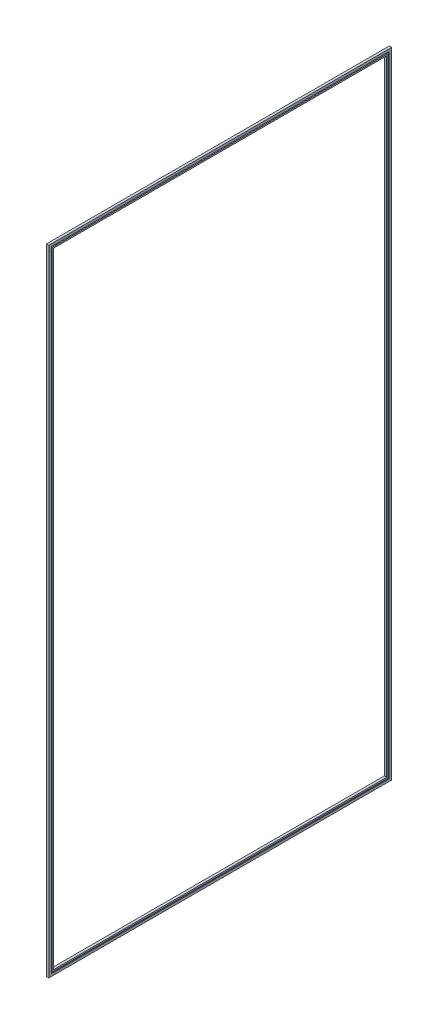
ISO-10303-21;
HEADER;
FILE_DESCRIPTION(('STEP AP214'),'2;1');
FILE_NAME('part.step','',(''),(''),'','','');
FILE_SCHEMA(('AUTOMOTIVE_DESIGN { 1 0 10303 214 1 1 1 1 }'));
ENDSEC;
DATA;
#1=APPLICATION_CONTEXT('core data for automotive mechanical design processes');
#2=APPLICATION_PROTOCOL_DEFINITION('international standard','automotive_design',2000,#1);
#3=PRODUCT_CONTEXT('',#1,'mechanical');
#4=PRODUCT('Part','Part','',(#3));
#5=PRODUCT_RELATED_PRODUCT_CATEGORY('part','',(#4));
#6=PRODUCT_DEFINITION_FORMATION('','',#4);
#7=PRODUCT_DEFINITION_CONTEXT('part definition',#1,'design');
#8=PRODUCT_DEFINITION('design','',#6,#7);
#9=PRODUCT_DEFINITION_SHAPE('','',#8);
#10=(LENGTH_UNIT() NAMED_UNIT(*) SI_UNIT(.MILLI.,.METRE.));
#11=(NAMED_UNIT(*) PLANE_ANGLE_UNIT() SI_UNIT($,.RADIAN.));
#12=(NAMED_UNIT(*) SI_UNIT($,.STERADIAN.) SOLID_ANGLE_UNIT());
#13=UNCERTAINTY_MEASURE_WITH_UNIT(LENGTH_MEASURE(1.E-05),#10,'distance_accuracy_value','');
#14=(GEOMETRIC_REPRESENTATION_CONTEXT(3) GLOBAL_UNCERTAINTY_ASSIGNED_CONTEXT((#13)) GLOBAL_UNIT_ASSIGNED_CONTEXT((#10,
#11,#12)) REPRESENTATION_CONTEXT('',''));
#15=CARTESIAN_POINT('',(0.,0.,0.));
#16=DIRECTION('',(0.,0.,1.));
#17=DIRECTION('',(1.,0.,0.));
#18=AXIS2_PLACEMENT_3D('',#15,#16,#17);
#19=CARTESIAN_POINT('',(1.,0.,0.));
#20=DIRECTION('',(-1.,0.,0.));
#21=DIRECTION('',(0.,0.,1.));
#22=AXIS2_PLACEMENT_3D('',#19,#20,#21);
#23=PLANE('',#22);
#24=DIRECTION('',(0.,1.,0.));
#25=VECTOR('',#24,1.);
#26=CARTESIAN_POINT('',(1.,-128.5,-68.5));
#27=LINE('',#26,#25);
#28=CARTESIAN_POINT('',(1.,-128.5,-68.5));
#29=VERTEX_POINT('',#28);
#30=CARTESIAN_POINT('',(1.,128.5,-68.5));
#31=VERTEX_POINT('',#30);
#32=EDGE_CURVE('E324',#29,#31,#27,.T.);
#33=ORIENTED_EDGE('',*,*,#32,.F.);
#34=DIRECTION('',(0.,0.,-1.));
#35=VECTOR('',#34,1.);
#36=CARTESIAN_POINT('',(1.,-128.5,-68.5));
#37=LINE('',#36,#35);
#38=CARTESIAN_POINT('',(1.,-128.5,68.5));
#39=VERTEX_POINT('',#38);
#40=EDGE_CURVE('E335',#39,#29,#37,.T.);
#41=ORIENTED_EDGE('',*,*,#40,.F.);
#42=DIRECTION('',(0.,-1.,0.));
#43=VECTOR('',#42,1.);
#44=CARTESIAN_POINT('',(1.,-128.5,68.5));
#45=LINE('',#44,#43);
#46=CARTESIAN_POINT('',(1.,128.5,68.5));
#47=VERTEX_POINT('',#46);
#48=EDGE_CURVE('E331',#47,#39,#45,.T.);
#49=ORIENTED_EDGE('',*,*,#48,.F.);
#50=DIRECTION('',(0.,0.,1.));
#51=VECTOR('',#50,1.);
#52=CARTESIAN_POINT('',(1.,128.5,-68.5));
#53=LINE('',#52,#51);
#54=EDGE_CURVE('E327',#31,#47,#53,.T.);
#55=ORIENTED_EDGE('',*,*,#54,.F.);
#56=EDGE_LOOP('',(#33,#41,#49,#55));
#57=FACE_BOUND('',#56,.T.);
#58=DIRECTION('',(0.,-1.,0.));
#59=VECTOR('',#58,1.);
#60=CARTESIAN_POINT('',(1.,129.1,69.1));
#61=LINE('',#60,#59);
#62=CARTESIAN_POINT('',(1.,129.1,69.1));
#63=VERTEX_POINT('',#62);
#64=CARTESIAN_POINT('',(1.,-129.1,69.1));
#65=VERTEX_POINT('',#64);
#66=EDGE_CURVE('E236',#63,#65,#61,.T.);
#67=ORIENTED_EDGE('',*,*,#66,.T.);
#68=DIRECTION('',(0.,0.,-1.));
#69=VECTOR('',#68,1.);
#70=CARTESIAN_POINT('',(1.,-129.1,69.1));
#71=LINE('',#70,#69);
#72=CARTESIAN_POINT('',(1.,-129.1,-69.1));
#73=VERTEX_POINT('',#72);
#74=EDGE_CURVE('E240',#65,#73,#71,.T.);
#75=ORIENTED_EDGE('',*,*,#74,.T.);
#76=DIRECTION('',(0.,-1.,0.));
#77=VECTOR('',#76,1.);
#78=CARTESIAN_POINT('',(1.,129.1,-69.1));
#79=LINE('',#78,#77);
#80=CARTESIAN_POINT('',(1.,129.1,-69.1));
#81=VERTEX_POINT('',#80);
#82=EDGE_CURVE('E244',#81,#73,#79,.T.);
#83=ORIENTED_EDGE('',*,*,#82,.F.);
#84=DIRECTION('',(0.,0.,-1.));
#85=VECTOR('',#84,1.);
#86=CARTESIAN_POINT('',(1.,129.1,69.1));
#87=LINE('',#86,#85);
#88=EDGE_CURVE('E193',#63,#81,#87,.T.);
#89=ORIENTED_EDGE('',*,*,#88,.F.);
#90=EDGE_LOOP('',(#67,#75,#83,#89));
#91=FACE_BOUND('',#90,.T.);
#92=ADVANCED_FACE('F48',(#57,#91),#23,.F.);
#93=DIRECTION('',(0.,0.,-1.));
#94=VECTOR('',#93,1.);
#95=CARTESIAN_POINT('',(1.,-129.5,69.5));
#96=LINE('',#95,#94);
#97=CARTESIAN_POINT('',(1.,-129.5,69.5));
#98=VERTEX_POINT('',#97);
#99=CARTESIAN_POINT('',(1.,-129.5,-69.5));
#100=VERTEX_POINT('',#99);
#101=EDGE_CURVE('E275',#98,#100,#96,.T.);
#102=ORIENTED_EDGE('',*,*,#101,.F.);
#103=DIRECTION('',(0.,-1.,0.));
#104=VECTOR('',#103,1.);
#105=CARTESIAN_POINT('',(1.,129.5,69.5));
#106=LINE('',#105,#104);
#107=CARTESIAN_POINT('',(1.,129.5,69.5));
#108=VERTEX_POINT('',#107);
#109=EDGE_CURVE('E64',#108,#98,#106,.T.);
#110=ORIENTED_EDGE('',*,*,#109,.F.);
#111=DIRECTION('',(0.,0.,-1.));
#112=VECTOR('',#111,1.);
#113=CARTESIAN_POINT('',(1.,129.5,69.5));
#114=LINE('',#113,#112);
#115=CARTESIAN_POINT('',(1.,129.5,-69.5));
#116=VERTEX_POINT('',#115);
#117=EDGE_CURVE('E262',#108,#116,#114,.T.);
#118=ORIENTED_EDGE('',*,*,#117,.T.);
#119=DIRECTION('',(0.,-1.,0.));
#120=VECTOR('',#119,1.);
#121=CARTESIAN_POINT('',(1.,129.5,-69.5));
#122=LINE('',#121,#120);
#123=EDGE_CURVE('E279',#116,#100,#122,.T.);
#124=ORIENTED_EDGE('',*,*,#123,.T.);
#125=EDGE_LOOP('',(#102,#110,#118,#124));
#126=FACE_BOUND('',#125,.T.);
#127=DIRECTION('',(0.,0.,1.));
#128=VECTOR('',#127,1.);
#129=CARTESIAN_POINT('',(1.,130.5,-70.5));
#130=LINE('',#129,#128);
#131=CARTESIAN_POINT('',(1.,130.5,-70.5));
#132=VERTEX_POINT('',#131);
#133=CARTESIAN_POINT('',(1.,130.5,70.5));
#134=VERTEX_POINT('',#133);
#135=EDGE_CURVE('E367',#132,#134,#130,.T.);
#136=ORIENTED_EDGE('',*,*,#135,.T.);
#137=DIRECTION('',(0.,-1.,0.));
#138=VECTOR('',#137,1.);
#139=CARTESIAN_POINT('',(1.,-130.5,70.5));
#140=LINE('',#139,#138);
#141=CARTESIAN_POINT('',(1.,-130.5,70.5));
#142=VERTEX_POINT('',#141);
#143=EDGE_CURVE('E371',#134,#142,#140,.T.);
#144=ORIENTED_EDGE('',*,*,#143,.T.);
#145=DIRECTION('',(0.,0.,-1.));
#146=VECTOR('',#145,1.);
#147=CARTESIAN_POINT('',(1.,-130.5,-70.5));
#148=LINE('',#147,#146);
#149=CARTESIAN_POINT('',(1.,-130.5,-70.5));
#150=VERTEX_POINT('',#149);
#151=EDGE_CURVE('E375',#142,#150,#148,.T.);
#152=ORIENTED_EDGE('',*,*,#151,.T.);
#153=DIRECTION('',(0.,1.,0.));
#154=VECTOR('',#153,1.);
#155=CARTESIAN_POINT('',(1.,-130.5,-70.5));
#156=LINE('',#155,#154);
#157=EDGE_CURVE('E378',#150,#132,#156,.T.);
#158=ORIENTED_EDGE('',*,*,#157,.T.);
#159=EDGE_LOOP('',(#136,#144,#152,#158));
#160=FACE_BOUND('',#159,.T.);
#161=ADVANCED_FACE('F421',(#126,#160),#23,.F.);
#162=CARTESIAN_POINT('',(0.,0.,0.));
#163=DIRECTION('',(-1.,0.,0.));
#164=DIRECTION('',(0.,0.,1.));
#165=AXIS2_PLACEMENT_3D('',#162,#163,#164);
#166=PLANE('',#165);
#167=DIRECTION('',(0.,0.,1.));
#168=VECTOR('',#167,1.);
#169=CARTESIAN_POINT('',(0.,130.5,-70.5));
#170=LINE('',#169,#168);
#171=CARTESIAN_POINT('',(0.,130.5,-70.5));
#172=VERTEX_POINT('',#171);
#173=CARTESIAN_POINT('',(0.,130.5,70.5));
#174=VERTEX_POINT('',#173);
#175=EDGE_CURVE('E366',#172,#174,#170,.T.);
#176=ORIENTED_EDGE('',*,*,#175,.F.);
#177=DIRECTION('',(0.,1.,0.));
#178=VECTOR('',#177,1.);
#179=CARTESIAN_POINT('',(0.,-130.5,-70.5));
#180=LINE('',#179,#178);
#181=CARTESIAN_POINT('',(0.,-130.5,-70.5));
#182=VERTEX_POINT('',#181);
#183=EDGE_CURVE('E372',#182,#172,#180,.T.);
#184=ORIENTED_EDGE('',*,*,#183,.F.);
#185=DIRECTION('',(0.,0.,-1.));
#186=VECTOR('',#185,1.);
#187=CARTESIAN_POINT('',(0.,-130.5,-70.5));
#188=LINE('',#187,#186);
#189=CARTESIAN_POINT('',(0.,-130.5,70.5));
#190=VERTEX_POINT('',#189);
#191=EDGE_CURVE('E388',#190,#182,#188,.T.);
#192=ORIENTED_EDGE('',*,*,#191,.F.);
#193=DIRECTION('',(0.,-1.,0.));
#194=VECTOR('',#193,1.);
#195=CARTESIAN_POINT('',(0.,-130.5,70.5));
#196=LINE('',#195,#194);
#197=EDGE_CURVE('E385',#174,#190,#196,.T.);
#198=ORIENTED_EDGE('',*,*,#197,.F.);
#199=EDGE_LOOP('',(#176,#184,#192,#198));
#200=FACE_BOUND('',#199,.T.);
#201=DIRECTION('',(0.,0.,-1.));
#202=VECTOR('',#201,1.);
#203=CARTESIAN_POINT('',(0.,-128.5,-68.5));
#204=LINE('',#203,#202);
#205=CARTESIAN_POINT('',(0.,-128.5,68.5));
#206=VERTEX_POINT('',#205);
#207=CARTESIAN_POINT('',(0.,-128.5,-68.5));
#208=VERTEX_POINT('',#207);
#209=EDGE_CURVE('E328',#206,#208,#204,.T.);
#210=ORIENTED_EDGE('',*,*,#209,.T.);
#211=DIRECTION('',(0.,1.,0.));
#212=VECTOR('',#211,1.);
#213=CARTESIAN_POINT('',(0.,-128.5,-68.5));
#214=LINE('',#213,#212);
#215=CARTESIAN_POINT('',(0.,128.5,-68.5));
#216=VERTEX_POINT('',#215);
#217=EDGE_CURVE('E310',#208,#216,#214,.T.);
#218=ORIENTED_EDGE('',*,*,#217,.T.);
#219=DIRECTION('',(0.,0.,1.));
#220=VECTOR('',#219,1.);
#221=CARTESIAN_POINT('',(0.,128.5,-68.5));
#222=LINE('',#221,#220);
#223=CARTESIAN_POINT('',(0.,128.5,68.5));
#224=VERTEX_POINT('',#223);
#225=EDGE_CURVE('E342',#216,#224,#222,.T.);
#226=ORIENTED_EDGE('',*,*,#225,.T.);
#227=DIRECTION('',(0.,-1.,0.));
#228=VECTOR('',#227,1.);
#229=CARTESIAN_POINT('',(0.,-128.5,68.5));
#230=LINE('',#229,#228);
#231=EDGE_CURVE('E346',#224,#206,#230,.T.);
#232=ORIENTED_EDGE('',*,*,#231,.T.);
#233=EDGE_LOOP('',(#210,#218,#226,#232));
#234=FACE_BOUND('',#233,.T.);
#235=ADVANCED_FACE('F411',(#200,#234),#166,.T.);
#236=CARTESIAN_POINT('',(1.,130.5,-70.5));
#237=DIRECTION('',(0.,-1.,0.));
#238=DIRECTION('',(0.,0.,-1.));
#239=AXIS2_PLACEMENT_3D('',#236,#237,#238);
#240=PLANE('',#239);
#241=ORIENTED_EDGE('',*,*,#175,.T.);
#242=DIRECTION('',(-1.,0.,0.));
#243=VECTOR('',#242,1.);
#244=CARTESIAN_POINT('',(1.,130.5,70.5));
#245=LINE('',#244,#243);
#246=EDGE_CURVE('E12',#134,#174,#245,.T.);
#247=ORIENTED_EDGE('',*,*,#246,.F.);
#248=ORIENTED_EDGE('',*,*,#135,.F.);
#249=DIRECTION('',(-1.,0.,0.));
#250=VECTOR('',#249,1.);
#251=CARTESIAN_POINT('',(1.,130.5,-70.5));
#252=LINE('',#251,#250);
#253=EDGE_CURVE('E381',#132,#172,#252,.T.);
#254=ORIENTED_EDGE('',*,*,#253,.T.);
#255=EDGE_LOOP('',(#241,#247,#248,#254));
#256=FACE_BOUND('',#255,.T.);
#257=ADVANCED_FACE('F50',(#256),#240,.F.);
#258=CARTESIAN_POINT('',(1.,-130.5,70.5));
#259=DIRECTION('',(0.,0.,-1.));
#260=DIRECTION('',(-1.,0.,0.));
#261=AXIS2_PLACEMENT_3D('',#258,#259,#260);
#262=PLANE('',#261);
#263=ORIENTED_EDGE('',*,*,#197,.T.);
#264=DIRECTION('',(-1.,0.,0.));
#265=VECTOR('',#264,1.);
#266=CARTESIAN_POINT('',(1.,-130.5,70.5));
#267=LINE('',#266,#265);
#268=EDGE_CURVE('E57',#142,#190,#267,.T.);
#269=ORIENTED_EDGE('',*,*,#268,.F.);
#270=ORIENTED_EDGE('',*,*,#143,.F.);
#271=ORIENTED_EDGE('',*,*,#246,.T.);
#272=EDGE_LOOP('',(#263,#269,#270,#271));
#273=FACE_BOUND('',#272,.T.);
#274=ADVANCED_FACE('F422',(#273),#262,.F.);
#275=CARTESIAN_POINT('',(1.,-130.5,-70.5));
#276=DIRECTION('',(0.,1.,0.));
#277=DIRECTION('',(0.,0.,1.));
#278=AXIS2_PLACEMENT_3D('',#275,#276,#277);
#279=PLANE('',#278);
#280=ORIENTED_EDGE('',*,*,#191,.T.);
#281=DIRECTION('',(-1.,0.,0.));
#282=VECTOR('',#281,1.);
#283=CARTESIAN_POINT('',(1.,-130.5,-70.5));
#284=LINE('',#283,#282);
#285=EDGE_CURVE('E396',#150,#182,#284,.T.);
#286=ORIENTED_EDGE('',*,*,#285,.F.);
#287=ORIENTED_EDGE('',*,*,#151,.F.);
#288=ORIENTED_EDGE('',*,*,#268,.T.);
#289=EDGE_LOOP('',(#280,#286,#287,#288));
#290=FACE_BOUND('',#289,.T.);
#291=ADVANCED_FACE('F405',(#290),#279,.F.);
#292=CARTESIAN_POINT('',(1.,-130.5,-70.5));
#293=DIRECTION('',(0.,0.,1.));
#294=DIRECTION('',(1.,0.,0.));
#295=AXIS2_PLACEMENT_3D('',#292,#293,#294);
#296=PLANE('',#295);
#297=ORIENTED_EDGE('',*,*,#183,.T.);
#298=ORIENTED_EDGE('',*,*,#253,.F.);
#299=ORIENTED_EDGE('',*,*,#157,.F.);
#300=ORIENTED_EDGE('',*,*,#285,.T.);
#301=EDGE_LOOP('',(#297,#298,#299,#300));
#302=FACE_BOUND('',#301,.T.);
#303=ADVANCED_FACE('F415',(#302),#296,.F.);
#304=CARTESIAN_POINT('',(1.,-128.5,-68.5));
#305=DIRECTION('',(0.,0.,1.));
#306=DIRECTION('',(1.,0.,0.));
#307=AXIS2_PLACEMENT_3D('',#304,#305,#306);
#308=PLANE('',#307);
#309=ORIENTED_EDGE('',*,*,#217,.F.);
#310=DIRECTION('',(-1.,0.,0.));
#311=VECTOR('',#310,1.);
#312=CARTESIAN_POINT('',(1.,-128.5,-68.5));
#313=LINE('',#312,#311);
#314=EDGE_CURVE('E338',#29,#208,#313,.T.);
#315=ORIENTED_EDGE('',*,*,#314,.F.);
#316=ORIENTED_EDGE('',*,*,#32,.T.);
#317=DIRECTION('',(-1.,0.,0.));
#318=VECTOR('',#317,1.);
#319=CARTESIAN_POINT('',(1.,128.5,-68.5));
#320=LINE('',#319,#318);
#321=EDGE_CURVE('E362',#31,#216,#320,.T.);
#322=ORIENTED_EDGE('',*,*,#321,.T.);
#323=EDGE_LOOP('',(#309,#315,#316,#322));
#324=FACE_BOUND('',#323,.T.);
#325=ADVANCED_FACE('F441',(#324),#308,.T.);
#326=CARTESIAN_POINT('',(1.,128.5,-68.5));
#327=DIRECTION('',(0.,-1.,0.));
#328=DIRECTION('',(0.,0.,-1.));
#329=AXIS2_PLACEMENT_3D('',#326,#327,#328);
#330=PLANE('',#329);
#331=ORIENTED_EDGE('',*,*,#225,.F.);
#332=ORIENTED_EDGE('',*,*,#321,.F.);
#333=ORIENTED_EDGE('',*,*,#54,.T.);
#334=DIRECTION('',(-1.,0.,0.));
#335=VECTOR('',#334,1.);
#336=CARTESIAN_POINT('',(1.,128.5,68.5));
#337=LINE('',#336,#335);
#338=EDGE_CURVE('E359',#47,#224,#337,.T.);
#339=ORIENTED_EDGE('',*,*,#338,.T.);
#340=EDGE_LOOP('',(#331,#332,#333,#339));
#341=FACE_BOUND('',#340,.T.);
#342=ADVANCED_FACE('F449',(#341),#330,.T.);
#343=CARTESIAN_POINT('',(1.,-128.5,68.5));
#344=DIRECTION('',(0.,0.,-1.));
#345=DIRECTION('',(-1.,0.,0.));
#346=AXIS2_PLACEMENT_3D('',#343,#344,#345);
#347=PLANE('',#346);
#348=ORIENTED_EDGE('',*,*,#231,.F.);
#349=ORIENTED_EDGE('',*,*,#338,.F.);
#350=ORIENTED_EDGE('',*,*,#48,.T.);
#351=DIRECTION('',(-1.,0.,0.));
#352=VECTOR('',#351,1.);
#353=CARTESIAN_POINT('',(1.,-128.5,68.5));
#354=LINE('',#353,#352);
#355=EDGE_CURVE('E356',#39,#206,#354,.T.);
#356=ORIENTED_EDGE('',*,*,#355,.T.);
#357=EDGE_LOOP('',(#348,#349,#350,#356));
#358=FACE_BOUND('',#357,.T.);
#359=ADVANCED_FACE('F454',(#358),#347,.T.);
#360=CARTESIAN_POINT('',(1.,-128.5,-68.5));
#361=DIRECTION('',(0.,1.,0.));
#362=DIRECTION('',(0.,0.,1.));
#363=AXIS2_PLACEMENT_3D('',#360,#361,#362);
#364=PLANE('',#363);
#365=ORIENTED_EDGE('',*,*,#209,.F.);
#366=ORIENTED_EDGE('',*,*,#355,.F.);
#367=ORIENTED_EDGE('',*,*,#40,.T.);
#368=ORIENTED_EDGE('',*,*,#314,.T.);
#369=EDGE_LOOP('',(#365,#366,#367,#368));
#370=FACE_BOUND('',#369,.T.);
#371=ADVANCED_FACE('F460',(#370),#364,.T.);
#372=CARTESIAN_POINT('',(0.800000000000002,129.5,69.5));
#373=DIRECTION('',(0.,0.,1.));
#374=DIRECTION('',(1.,0.,0.));
#375=AXIS2_PLACEMENT_3D('',#372,#373,#374);
#376=PLANE('',#375);
#377=ORIENTED_EDGE('',*,*,#109,.T.);
#378=DIRECTION('',(1.,0.,0.));
#379=VECTOR('',#378,1.);
#380=CARTESIAN_POINT('',(0.800000000000002,-129.5,69.5));
#381=LINE('',#380,#379);
#382=CARTESIAN_POINT('',(0.800000000000002,-129.5,69.5));
#383=VERTEX_POINT('',#382);
#384=EDGE_CURVE('E272',#383,#98,#381,.T.);
#385=ORIENTED_EDGE('',*,*,#384,.F.);
#386=DIRECTION('',(0.,-1.,0.));
#387=VECTOR('',#386,1.);
#388=CARTESIAN_POINT('',(0.800000000000002,129.5,69.5));
#389=LINE('',#388,#387);
#390=CARTESIAN_POINT('',(0.800000000000002,129.5,69.5));
#391=VERTEX_POINT('',#390);
#392=EDGE_CURVE('E257',#391,#383,#389,.T.);
#393=ORIENTED_EDGE('',*,*,#392,.F.);
#394=DIRECTION('',(1.,0.,0.));
#395=VECTOR('',#394,1.);
#396=CARTESIAN_POINT('',(0.800000000000002,129.5,69.5));
#397=LINE('',#396,#395);
#398=EDGE_CURVE('E286',#391,#108,#397,.T.);
#399=ORIENTED_EDGE('',*,*,#398,.T.);
#400=EDGE_LOOP('',(#377,#385,#393,#399));
#401=FACE_BOUND('',#400,.T.);
#402=ADVANCED_FACE('F471',(#401),#376,.F.);
#403=CARTESIAN_POINT('',(0.800000000000002,129.5,69.5));
#404=DIRECTION('',(0.,-1.,0.));
#405=DIRECTION('',(0.,0.,-1.));
#406=AXIS2_PLACEMENT_3D('',#403,#404,#405);
#407=PLANE('',#406);
#408=ORIENTED_EDGE('',*,*,#117,.F.);
#409=ORIENTED_EDGE('',*,*,#398,.F.);
#410=DIRECTION('',(0.,0.,-1.));
#411=VECTOR('',#410,1.);
#412=CARTESIAN_POINT('',(0.800000000000002,129.5,69.5));
#413=LINE('',#412,#411);
#414=CARTESIAN_POINT('',(0.800000000000002,129.5,-69.5));
#415=VERTEX_POINT('',#414);
#416=EDGE_CURVE('E269',#391,#415,#413,.T.);
#417=ORIENTED_EDGE('',*,*,#416,.T.);
#418=DIRECTION('',(1.,0.,0.));
#419=VECTOR('',#418,1.);
#420=CARTESIAN_POINT('',(0.800000000000002,129.5,-69.5));
#421=LINE('',#420,#419);
#422=EDGE_CURVE('E290',#415,#116,#421,.T.);
#423=ORIENTED_EDGE('',*,*,#422,.T.);
#424=EDGE_LOOP('',(#408,#409,#417,#423));
#425=FACE_BOUND('',#424,.T.);
#426=ADVANCED_FACE('F505',(#425),#407,.T.);
#427=CARTESIAN_POINT('',(0.800000000000002,129.5,-69.5));
#428=DIRECTION('',(0.,0.,1.));
#429=DIRECTION('',(0.,-1.,0.));
#430=AXIS2_PLACEMENT_3D('',#427,#428,#429);
#431=PLANE('',#430);
#432=ORIENTED_EDGE('',*,*,#123,.F.);
#433=ORIENTED_EDGE('',*,*,#422,.F.);
#434=DIRECTION('',(0.,-1.,0.));
#435=VECTOR('',#434,1.);
#436=CARTESIAN_POINT('',(0.800000000000002,129.5,-69.5));
#437=LINE('',#436,#435);
#438=CARTESIAN_POINT('',(0.800000000000002,-129.5,-69.5));
#439=VERTEX_POINT('',#438);
#440=EDGE_CURVE('E266',#415,#439,#437,.T.);
#441=ORIENTED_EDGE('',*,*,#440,.T.);
#442=DIRECTION('',(1.,0.,0.));
#443=VECTOR('',#442,1.);
#444=CARTESIAN_POINT('',(0.800000000000002,-129.5,-69.5));
#445=LINE('',#444,#443);
#446=EDGE_CURVE('E293',#439,#100,#445,.T.);
#447=ORIENTED_EDGE('',*,*,#446,.T.);
#448=EDGE_LOOP('',(#432,#433,#441,#447));
#449=FACE_BOUND('',#448,.T.);
#450=ADVANCED_FACE('F510',(#449),#431,.T.);
#451=CARTESIAN_POINT('',(0.800000000000002,-129.5,69.5));
#452=DIRECTION('',(0.,-1.,0.));
#453=DIRECTION('',(0.,0.,-1.));
#454=AXIS2_PLACEMENT_3D('',#451,#452,#453);
#455=PLANE('',#454);
#456=ORIENTED_EDGE('',*,*,#101,.T.);
#457=ORIENTED_EDGE('',*,*,#446,.F.);
#458=DIRECTION('',(0.,0.,-1.));
#459=VECTOR('',#458,1.);
#460=CARTESIAN_POINT('',(0.800000000000002,-129.5,69.5));
#461=LINE('',#460,#459);
#462=EDGE_CURVE('E261',#383,#439,#461,.T.);
#463=ORIENTED_EDGE('',*,*,#462,.F.);
#464=ORIENTED_EDGE('',*,*,#384,.T.);
#465=EDGE_LOOP('',(#456,#457,#463,#464));
#466=FACE_BOUND('',#465,.T.);
#467=ADVANCED_FACE('F506',(#466),#455,.F.);
#468=CARTESIAN_POINT('',(0.800000000000002,129.1,69.1));
#469=DIRECTION('',(0.,0.,1.));
#470=DIRECTION('',(1.,0.,0.));
#471=AXIS2_PLACEMENT_3D('',#468,#469,#470);
#472=PLANE('',#471);
#473=ORIENTED_EDGE('',*,*,#66,.F.);
#474=DIRECTION('',(1.,0.,0.));
#475=VECTOR('',#474,1.);
#476=CARTESIAN_POINT('',(0.800000000000002,129.1,69.1));
#477=LINE('',#476,#475);
#478=CARTESIAN_POINT('',(0.400000000000005,129.1,69.1));
#479=VERTEX_POINT('',#478);
#480=EDGE_CURVE('E198',#479,#63,#477,.T.);
#481=ORIENTED_EDGE('',*,*,#480,.F.);
#482=DIRECTION('',(0.,1.,0.));
#483=VECTOR('',#482,1.);
#484=CARTESIAN_POINT('',(0.400000000000005,129.1,69.1));
#485=LINE('',#484,#483);
#486=CARTESIAN_POINT('',(0.400000000000005,-129.1,69.1));
#487=VERTEX_POINT('',#486);
#488=EDGE_CURVE('E207',#487,#479,#485,.T.);
#489=ORIENTED_EDGE('',*,*,#488,.F.);
#490=DIRECTION('',(1.,0.,0.));
#491=VECTOR('',#490,1.);
#492=CARTESIAN_POINT('',(0.800000000000002,-129.1,69.1));
#493=LINE('',#492,#491);
#494=EDGE_CURVE('E249',#487,#65,#493,.T.);
#495=ORIENTED_EDGE('',*,*,#494,.T.);
#496=EDGE_LOOP('',(#473,#481,#489,#495));
#497=FACE_BOUND('',#496,.T.);
#498=ADVANCED_FACE('F509',(#497),#472,.T.);
#499=CARTESIAN_POINT('',(0.800000000000002,129.1,69.1));
#500=DIRECTION('',(0.,-1.,0.));
#501=DIRECTION('',(0.,0.,-1.));
#502=AXIS2_PLACEMENT_3D('',#499,#500,#501);
#503=PLANE('',#502);
#504=ORIENTED_EDGE('',*,*,#88,.T.);
#505=DIRECTION('',(1.,0.,0.));
#506=VECTOR('',#505,1.);
#507=CARTESIAN_POINT('',(0.800000000000002,129.1,-69.1));
#508=LINE('',#507,#506);
#509=CARTESIAN_POINT('',(0.400000000000005,129.1,-69.1));
#510=VERTEX_POINT('',#509);
#511=EDGE_CURVE('E187',#510,#81,#508,.T.);
#512=ORIENTED_EDGE('',*,*,#511,.F.);
#513=DIRECTION('',(0.,0.,-1.));
#514=VECTOR('',#513,1.);
#515=CARTESIAN_POINT('',(0.400000000000005,129.1,69.1));
#516=LINE('',#515,#514);
#517=EDGE_CURVE('E191',#479,#510,#516,.T.);
#518=ORIENTED_EDGE('',*,*,#517,.F.);
#519=ORIENTED_EDGE('',*,*,#480,.T.);
#520=EDGE_LOOP('',(#504,#512,#518,#519));
#521=FACE_BOUND('',#520,.T.);
#522=ADVANCED_FACE('F189',(#521),#503,.F.);
#523=CARTESIAN_POINT('',(0.800000000000002,129.1,-69.1));
#524=DIRECTION('',(0.,0.,1.));
#525=DIRECTION('',(0.,-1.,0.));
#526=AXIS2_PLACEMENT_3D('',#523,#524,#525);
#527=PLANE('',#526);
#528=ORIENTED_EDGE('',*,*,#82,.T.);
#529=DIRECTION('',(1.,0.,0.));
#530=VECTOR('',#529,1.);
#531=CARTESIAN_POINT('',(0.800000000000002,-129.1,-69.1));
#532=LINE('',#531,#530);
#533=CARTESIAN_POINT('',(0.400000000000005,-129.1,-69.1));
#534=VERTEX_POINT('',#533);
#535=EDGE_CURVE('E72',#534,#73,#532,.T.);
#536=ORIENTED_EDGE('',*,*,#535,.F.);
#537=DIRECTION('',(0.,-1.,0.));
#538=VECTOR('',#537,1.);
#539=CARTESIAN_POINT('',(0.400000000000005,129.1,-69.1));
#540=LINE('',#539,#538);
#541=EDGE_CURVE('E205',#510,#534,#540,.T.);
#542=ORIENTED_EDGE('',*,*,#541,.F.);
#543=ORIENTED_EDGE('',*,*,#511,.T.);
#544=EDGE_LOOP('',(#528,#536,#542,#543));
#545=FACE_BOUND('',#544,.T.);
#546=ADVANCED_FACE('F211',(#545),#527,.F.);
#547=CARTESIAN_POINT('',(0.800000000000002,-129.1,69.1));
#548=DIRECTION('',(0.,-1.,0.));
#549=DIRECTION('',(0.,0.,-1.));
#550=AXIS2_PLACEMENT_3D('',#547,#548,#549);
#551=PLANE('',#550);
#552=ORIENTED_EDGE('',*,*,#74,.F.);
#553=ORIENTED_EDGE('',*,*,#494,.F.);
#554=DIRECTION('',(0.,0.,1.));
#555=VECTOR('',#554,1.);
#556=CARTESIAN_POINT('',(0.400000000000005,-129.1,69.1));
#557=LINE('',#556,#555);
#558=EDGE_CURVE('E213',#534,#487,#557,.T.);
#559=ORIENTED_EDGE('',*,*,#558,.F.);
#560=ORIENTED_EDGE('',*,*,#535,.T.);
#561=EDGE_LOOP('',(#552,#553,#559,#560));
#562=FACE_BOUND('',#561,.T.);
#563=ADVANCED_FACE('F521',(#562),#551,.T.);
#564=CARTESIAN_POINT('',(0.400000000000005,0.,0.));
#565=DIRECTION('',(-1.,0.,0.));
#566=DIRECTION('',(0.,0.,1.));
#567=AXIS2_PLACEMENT_3D('',#564,#565,#566);
#568=PLANE('',#567);
#569=DIRECTION('',(0.,0.,-1.));
#570=VECTOR('',#569,1.);
#571=CARTESIAN_POINT('',(0.400000000000005,129.469059892324,-69.7000000000001));
#572=LINE('',#571,#570);
#573=CARTESIAN_POINT('',(0.400000000000005,129.469059892324,69.4690598923241));
#574=VERTEX_POINT('',#573);
#575=CARTESIAN_POINT('',(0.400000000000005,129.469059892324,-69.4690598923242));
#576=VERTEX_POINT('',#575);
#577=EDGE_CURVE('E300',#574,#576,#572,.T.);
#578=ORIENTED_EDGE('',*,*,#577,.F.);
#579=DIRECTION('',(0.,1.,0.));
#580=VECTOR('',#579,1.);
#581=CARTESIAN_POINT('',(0.400000000000005,129.7,69.4690598923241));
#582=LINE('',#581,#580);
#583=CARTESIAN_POINT('',(0.400000000000005,-129.469059892324,69.4690598923241));
#584=VERTEX_POINT('',#583);
#585=EDGE_CURVE('E289',#584,#574,#582,.T.);
#586=ORIENTED_EDGE('',*,*,#585,.F.);
#587=DIRECTION('',(0.,0.,1.));
#588=VECTOR('',#587,1.);
#589=CARTESIAN_POINT('',(0.400000000000005,-129.469059892324,69.7));
#590=LINE('',#589,#588);
#591=CARTESIAN_POINT('',(0.400000000000005,-129.469059892324,-69.4690598923242));
#592=VERTEX_POINT('',#591);
#593=EDGE_CURVE('E303',#592,#584,#590,.T.);
#594=ORIENTED_EDGE('',*,*,#593,.F.);
#595=DIRECTION('',(0.,-1.,0.));
#596=VECTOR('',#595,1.);
#597=CARTESIAN_POINT('',(0.400000000000005,-129.7,-69.4690598923242));
#598=LINE('',#597,#596);
#599=EDGE_CURVE('E306',#576,#592,#598,.T.);
#600=ORIENTED_EDGE('',*,*,#599,.F.);
#601=EDGE_LOOP('',(#578,#586,#594,#600));
#602=FACE_BOUND('',#601,.T.);
#603=ORIENTED_EDGE('',*,*,#541,.T.);
#604=ORIENTED_EDGE('',*,*,#558,.T.);
#605=ORIENTED_EDGE('',*,*,#488,.T.);
#606=ORIENTED_EDGE('',*,*,#517,.T.);
#607=EDGE_LOOP('',(#603,#604,#605,#606));
#608=FACE_BOUND('',#607,.T.);
#609=ADVANCED_FACE('F203',(#602,#608),#568,.F.);
#610=CARTESIAN_POINT('',(0.800000000000002,0.,0.));
#611=DIRECTION('',(-1.,0.,0.));
#612=DIRECTION('',(0.,0.,1.));
#613=AXIS2_PLACEMENT_3D('',#610,#611,#612);
#614=PLANE('',#613);
#615=ORIENTED_EDGE('',*,*,#392,.T.);
#616=ORIENTED_EDGE('',*,*,#462,.T.);
#617=ORIENTED_EDGE('',*,*,#440,.F.);
#618=ORIENTED_EDGE('',*,*,#416,.F.);
#619=EDGE_LOOP('',(#615,#616,#617,#618));
#620=FACE_BOUND('',#619,.T.);
#621=DIRECTION('',(0.,0.,1.));
#622=VECTOR('',#621,1.);
#623=CARTESIAN_POINT('',(0.800000000000002,-129.7,-69.7));
#624=LINE('',#623,#622);
#625=CARTESIAN_POINT('',(0.800000000000002,-129.7,-69.7));
#626=VERTEX_POINT('',#625);
#627=CARTESIAN_POINT('',(0.800000000000002,-129.7,69.7));
#628=VERTEX_POINT('',#627);
#629=EDGE_CURVE('E220',#626,#628,#624,.T.);
#630=ORIENTED_EDGE('',*,*,#629,.T.);
#631=DIRECTION('',(0.,1.,0.));
#632=VECTOR('',#631,1.);
#633=CARTESIAN_POINT('',(0.800000000000002,-129.7,69.7));
#634=LINE('',#633,#632);
#635=CARTESIAN_POINT('',(0.800000000000002,129.7,69.7));
#636=VERTEX_POINT('',#635);
#637=EDGE_CURVE('E224',#628,#636,#634,.T.);
#638=ORIENTED_EDGE('',*,*,#637,.T.);
#639=DIRECTION('',(0.,0.,-1.));
#640=VECTOR('',#639,1.);
#641=CARTESIAN_POINT('',(0.800000000000002,129.7,69.7));
#642=LINE('',#641,#640);
#643=CARTESIAN_POINT('',(0.800000000000002,129.7,-69.7000000000001));
#644=VERTEX_POINT('',#643);
#645=EDGE_CURVE('E228',#636,#644,#642,.T.);
#646=ORIENTED_EDGE('',*,*,#645,.T.);
#647=DIRECTION('',(0.,-1.,0.));
#648=VECTOR('',#647,1.);
#649=CARTESIAN_POINT('',(0.800000000000002,129.7,-69.7000000000001));
#650=LINE('',#649,#648);
#651=EDGE_CURVE('E232',#644,#626,#650,.T.);
#652=ORIENTED_EDGE('',*,*,#651,.T.);
#653=EDGE_LOOP('',(#630,#638,#646,#652));
#654=FACE_BOUND('',#653,.T.);
#655=ADVANCED_FACE('F482',(#620,#654),#614,.T.);
#656=CARTESIAN_POINT('',(0.400000000000005,0.,69.4690598923241));
#657=DIRECTION('',(-0.499999999999994,0.,0.866025403784442));
#658=DIRECTION('',(0.,-1.,0.));
#659=AXIS2_PLACEMENT_3D('',#656,#657,#658);
#660=PLANE('',#659);
#661=DIRECTION('',(0.774596669241488,-0.447213595499954,0.447213595499954));
#662=VECTOR('',#661,1.);
#663=CARTESIAN_POINT('',(-44.4493979483365,-103.57524791386,43.5752479138598));
#664=LINE('',#663,#662);
#665=EDGE_CURVE('E317',#628,#584,#664,.F.);
#666=ORIENTED_EDGE('',*,*,#665,.T.);
#667=ORIENTED_EDGE('',*,*,#585,.T.);
#668=DIRECTION('',(-0.774596669241479,-0.447213595499975,-0.447213595499948));
#669=VECTOR('',#668,1.);
#670=CARTESIAN_POINT('',(-44.4493979483381,103.575247913857,43.5752479138588));
#671=LINE('',#670,#669);
#672=EDGE_CURVE('E209',#574,#636,#671,.F.);
#673=ORIENTED_EDGE('',*,*,#672,.T.);
#674=ORIENTED_EDGE('',*,*,#637,.F.);
#675=EDGE_LOOP('',(#666,#667,#673,#674));
#676=FACE_BOUND('',#675,.T.);
#677=ADVANCED_FACE('F475',(#676),#660,.F.);
#678=CARTESIAN_POINT('',(0.400000000000005,129.469059892324,0.));
#679=DIRECTION('',(-0.500000000000017,0.866025403784429,0.));
#680=DIRECTION('',(0.,0.,1.));
#681=AXIS2_PLACEMENT_3D('',#678,#679,#680);
#682=PLANE('',#681);
#683=ORIENTED_EDGE('',*,*,#672,.F.);
#684=ORIENTED_EDGE('',*,*,#577,.T.);
#685=DIRECTION('',(-0.774596669241474,-0.447213595499972,0.447213595499959));
#686=VECTOR('',#685,1.);
#687=CARTESIAN_POINT('',(-23.6647882575099,115.575247913859,-55.5752479138593));
#688=LINE('',#687,#686);
#689=EDGE_CURVE('E314',#576,#644,#688,.F.);
#690=ORIENTED_EDGE('',*,*,#689,.T.);
#691=ORIENTED_EDGE('',*,*,#645,.F.);
#692=EDGE_LOOP('',(#683,#684,#690,#691));
#693=FACE_BOUND('',#692,.T.);
#694=ADVANCED_FACE('F481',(#693),#682,.F.);
#695=CARTESIAN_POINT('',(0.400000000000005,-129.469059892324,0.));
#696=DIRECTION('',(-0.499999999999994,-0.866025403784442,0.));
#697=DIRECTION('',(0.,0.,-1.));
#698=AXIS2_PLACEMENT_3D('',#695,#696,#697);
#699=PLANE('',#698);
#700=ORIENTED_EDGE('',*,*,#665,.F.);
#701=ORIENTED_EDGE('',*,*,#629,.F.);
#702=DIRECTION('',(0.774596669241484,-0.447213595499951,-0.447213595499964));
#703=VECTOR('',#702,1.);
#704=CARTESIAN_POINT('',(-23.6647882575105,-115.575247913859,-55.5752479138589));
#705=LINE('',#704,#703);
#706=EDGE_CURVE('E311',#626,#592,#705,.F.);
#707=ORIENTED_EDGE('',*,*,#706,.T.);
#708=ORIENTED_EDGE('',*,*,#593,.T.);
#709=EDGE_LOOP('',(#700,#701,#707,#708));
#710=FACE_BOUND('',#709,.T.);
#711=ADVANCED_FACE('F489',(#710),#699,.F.);
#712=CARTESIAN_POINT('',(0.400000000000005,0.,-69.4690598923242));
#713=DIRECTION('',(-0.500000000000005,0.,-0.866025403784436));
#714=DIRECTION('',(0.,1.,0.));
#715=AXIS2_PLACEMENT_3D('',#712,#713,#714);
#716=PLANE('',#715);
#717=ORIENTED_EDGE('',*,*,#689,.F.);
#718=ORIENTED_EDGE('',*,*,#599,.T.);
#719=ORIENTED_EDGE('',*,*,#706,.F.);
#720=ORIENTED_EDGE('',*,*,#651,.F.);
#721=EDGE_LOOP('',(#717,#718,#719,#720));
#722=FACE_BOUND('',#721,.T.);
#723=ADVANCED_FACE('F496',(#722),#716,.F.);
#724=CLOSED_SHELL('',(#92,#161,#235,#257,#274,#291,#303,#325,#342,#359,#371,#402,#426,#450,#467,
#498,#522,#546,#563,#609,#655,#677,#694,#711,#723));
#725=MANIFOLD_SOLID_BREP('B2',#724);
#726=ADVANCED_BREP_SHAPE_REPRESENTATION('',(#18,#725),#14);
#727=SHAPE_DEFINITION_REPRESENTATION(#9,#726);
ENDSEC;
END-ISO-10303-21;
